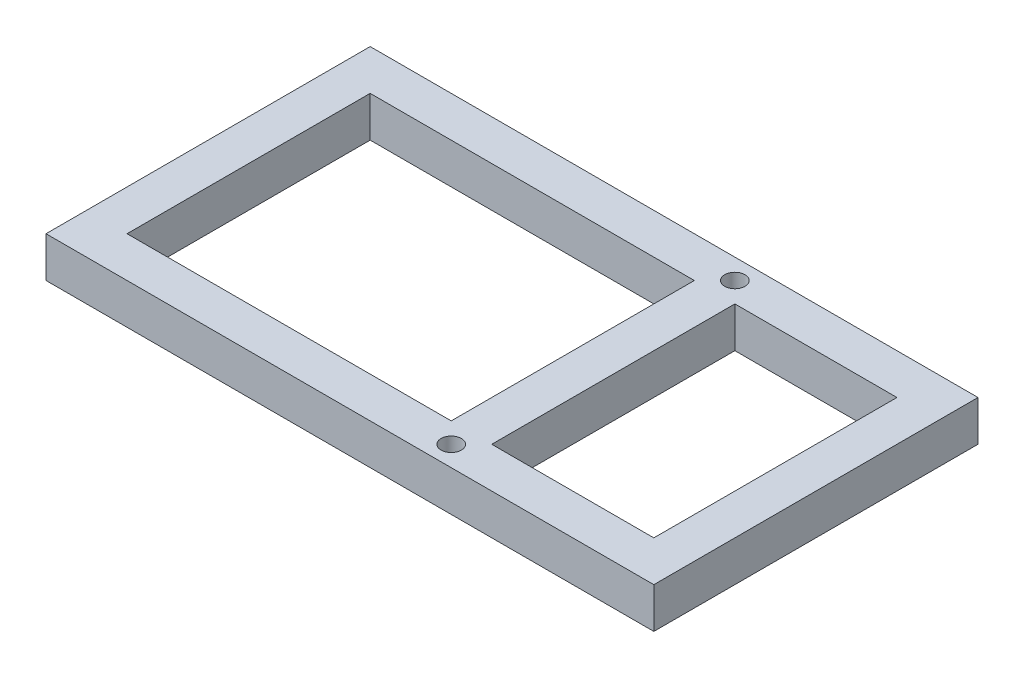
ISO-10303-21;
HEADER;
FILE_DESCRIPTION(('STEP AP214'),'2;1');
FILE_NAME('part.step','',(''),(''),'','','');
FILE_SCHEMA(('AUTOMOTIVE_DESIGN { 1 0 10303 214 1 1 1 1 }'));
ENDSEC;
DATA;
#1=APPLICATION_CONTEXT('core data for automotive mechanical design processes');
#2=APPLICATION_PROTOCOL_DEFINITION('international standard','automotive_design',2000,#1);
#3=PRODUCT_CONTEXT('',#1,'mechanical');
#4=PRODUCT('Part','Part','',(#3));
#5=PRODUCT_RELATED_PRODUCT_CATEGORY('part','',(#4));
#6=PRODUCT_DEFINITION_FORMATION('','',#4);
#7=PRODUCT_DEFINITION_CONTEXT('part definition',#1,'design');
#8=PRODUCT_DEFINITION('design','',#6,#7);
#9=PRODUCT_DEFINITION_SHAPE('','',#8);
#10=(LENGTH_UNIT() NAMED_UNIT(*) SI_UNIT(.MILLI.,.METRE.));
#11=(NAMED_UNIT(*) PLANE_ANGLE_UNIT() SI_UNIT($,.RADIAN.));
#12=(NAMED_UNIT(*) SI_UNIT($,.STERADIAN.) SOLID_ANGLE_UNIT());
#13=UNCERTAINTY_MEASURE_WITH_UNIT(LENGTH_MEASURE(1.E-05),#10,'distance_accuracy_value','');
#14=(GEOMETRIC_REPRESENTATION_CONTEXT(3) GLOBAL_UNCERTAINTY_ASSIGNED_CONTEXT((#13)) GLOBAL_UNIT_ASSIGNED_CONTEXT((#10,
#11,#12)) REPRESENTATION_CONTEXT('',''));
#15=CARTESIAN_POINT('',(0.,0.,0.));
#16=DIRECTION('',(0.,0.,1.));
#17=DIRECTION('',(1.,0.,0.));
#18=AXIS2_PLACEMENT_3D('',#15,#16,#17);
#19=CARTESIAN_POINT('',(75.,-10.,-40.));
#20=DIRECTION('',(1.,0.,0.));
#21=DIRECTION('',(0.,0.,-1.));
#22=AXIS2_PLACEMENT_3D('',#19,#20,#21);
#23=PLANE('',#22);
#24=DIRECTION('',(0.,0.,-1.));
#25=VECTOR('',#24,1.);
#26=CARTESIAN_POINT('',(75.,0.,-40.));
#27=LINE('',#26,#25);
#28=CARTESIAN_POINT('',(75.,0.,40.));
#29=VERTEX_POINT('',#28);
#30=CARTESIAN_POINT('',(75.,0.,-40.));
#31=VERTEX_POINT('',#30);
#32=EDGE_CURVE('E168',#29,#31,#27,.T.);
#33=ORIENTED_EDGE('',*,*,#32,.F.);
#34=DIRECTION('',(0.,1.,0.));
#35=VECTOR('',#34,1.);
#36=CARTESIAN_POINT('',(75.,-10.,40.));
#37=LINE('',#36,#35);
#38=CARTESIAN_POINT('',(75.,-10.,40.));
#39=VERTEX_POINT('',#38);
#40=EDGE_CURVE('E11',#39,#29,#37,.T.);
#41=ORIENTED_EDGE('',*,*,#40,.F.);
#42=DIRECTION('',(0.,0.,-1.));
#43=VECTOR('',#42,1.);
#44=CARTESIAN_POINT('',(75.,-10.,-40.));
#45=LINE('',#44,#43);
#46=CARTESIAN_POINT('',(75.,-10.,-40.));
#47=VERTEX_POINT('',#46);
#48=EDGE_CURVE('E202',#39,#47,#45,.T.);
#49=ORIENTED_EDGE('',*,*,#48,.T.);
#50=DIRECTION('',(0.,1.,0.));
#51=VECTOR('',#50,1.);
#52=CARTESIAN_POINT('',(75.,-10.,-40.));
#53=LINE('',#52,#51);
#54=EDGE_CURVE('E41',#47,#31,#53,.T.);
#55=ORIENTED_EDGE('',*,*,#54,.T.);
#56=EDGE_LOOP('',(#33,#41,#49,#55));
#57=FACE_BOUND('',#56,.T.);
#58=ADVANCED_FACE('F38',(#57),#23,.T.);
#59=CARTESIAN_POINT('',(-75.,-10.,40.));
#60=DIRECTION('',(0.,0.,1.));
#61=DIRECTION('',(1.,0.,0.));
#62=AXIS2_PLACEMENT_3D('',#59,#60,#61);
#63=PLANE('',#62);
#64=DIRECTION('',(1.,0.,0.));
#65=VECTOR('',#64,1.);
#66=CARTESIAN_POINT('',(-75.,0.,40.));
#67=LINE('',#66,#65);
#68=CARTESIAN_POINT('',(-75.,0.,40.));
#69=VERTEX_POINT('',#68);
#70=EDGE_CURVE('E206',#69,#29,#67,.T.);
#71=ORIENTED_EDGE('',*,*,#70,.F.);
#72=DIRECTION('',(0.,1.,0.));
#73=VECTOR('',#72,1.);
#74=CARTESIAN_POINT('',(-75.,-10.,40.));
#75=LINE('',#74,#73);
#76=CARTESIAN_POINT('',(-75.,-10.,40.));
#77=VERTEX_POINT('',#76);
#78=EDGE_CURVE('E46',#77,#69,#75,.T.);
#79=ORIENTED_EDGE('',*,*,#78,.F.);
#80=DIRECTION('',(1.,0.,0.));
#81=VECTOR('',#80,1.);
#82=CARTESIAN_POINT('',(-75.,-10.,40.));
#83=LINE('',#82,#81);
#84=EDGE_CURVE('E212',#77,#39,#83,.T.);
#85=ORIENTED_EDGE('',*,*,#84,.T.);
#86=ORIENTED_EDGE('',*,*,#40,.T.);
#87=EDGE_LOOP('',(#71,#79,#85,#86));
#88=FACE_BOUND('',#87,.T.);
#89=ADVANCED_FACE('F238',(#88),#63,.T.);
#90=CARTESIAN_POINT('',(-75.,-10.,-40.));
#91=DIRECTION('',(-1.,0.,0.));
#92=DIRECTION('',(0.,0.,1.));
#93=AXIS2_PLACEMENT_3D('',#90,#91,#92);
#94=PLANE('',#93);
#95=DIRECTION('',(0.,0.,1.));
#96=VECTOR('',#95,1.);
#97=CARTESIAN_POINT('',(-75.,0.,-40.));
#98=LINE('',#97,#96);
#99=CARTESIAN_POINT('',(-75.,0.,-40.));
#100=VERTEX_POINT('',#99);
#101=EDGE_CURVE('E220',#100,#69,#98,.T.);
#102=ORIENTED_EDGE('',*,*,#101,.F.);
#103=DIRECTION('',(0.,1.,0.));
#104=VECTOR('',#103,1.);
#105=CARTESIAN_POINT('',(-75.,-10.,-40.));
#106=LINE('',#105,#104);
#107=CARTESIAN_POINT('',(-75.,-10.,-40.));
#108=VERTEX_POINT('',#107);
#109=EDGE_CURVE('E225',#108,#100,#106,.T.);
#110=ORIENTED_EDGE('',*,*,#109,.F.);
#111=DIRECTION('',(0.,0.,1.));
#112=VECTOR('',#111,1.);
#113=CARTESIAN_POINT('',(-75.,-10.,-40.));
#114=LINE('',#113,#112);
#115=EDGE_CURVE('E209',#108,#77,#114,.T.);
#116=ORIENTED_EDGE('',*,*,#115,.T.);
#117=ORIENTED_EDGE('',*,*,#78,.T.);
#118=EDGE_LOOP('',(#102,#110,#116,#117));
#119=FACE_BOUND('',#118,.T.);
#120=ADVANCED_FACE('F243',(#119),#94,.T.);
#121=CARTESIAN_POINT('',(-75.,-10.,-40.));
#122=DIRECTION('',(0.,0.,-1.));
#123=DIRECTION('',(-1.,0.,0.));
#124=AXIS2_PLACEMENT_3D('',#121,#122,#123);
#125=PLANE('',#124);
#126=DIRECTION('',(-1.,0.,0.));
#127=VECTOR('',#126,1.);
#128=CARTESIAN_POINT('',(-75.,0.,-40.));
#129=LINE('',#128,#127);
#130=EDGE_CURVE('E217',#31,#100,#129,.T.);
#131=ORIENTED_EDGE('',*,*,#130,.F.);
#132=ORIENTED_EDGE('',*,*,#54,.F.);
#133=DIRECTION('',(-1.,0.,0.));
#134=VECTOR('',#133,1.);
#135=CARTESIAN_POINT('',(-75.,-10.,-40.));
#136=LINE('',#135,#134);
#137=EDGE_CURVE('E205',#47,#108,#136,.T.);
#138=ORIENTED_EDGE('',*,*,#137,.T.);
#139=ORIENTED_EDGE('',*,*,#109,.T.);
#140=EDGE_LOOP('',(#131,#132,#138,#139));
#141=FACE_BOUND('',#140,.T.);
#142=ADVANCED_FACE('F233',(#141),#125,.T.);
#143=CARTESIAN_POINT('',(0.,-10.,0.));
#144=DIRECTION('',(0.,1.,0.));
#145=DIRECTION('',(0.,0.,1.));
#146=AXIS2_PLACEMENT_3D('',#143,#144,#145);
#147=PLANE('',#146);
#148=CARTESIAN_POINT('',(20.,-10.,-35.));
#149=DIRECTION('',(0.,1.,0.));
#150=DIRECTION('',(0.,0.,1.));
#151=AXIS2_PLACEMENT_3D('',#148,#149,#150);
#152=CIRCLE('',#151,2.5);
#153=CARTESIAN_POINT('',(20.,-10.,-32.5));
#154=VERTEX_POINT('',#153);
#155=EDGE_CURVE('E187',#154,#154,#152,.T.);
#156=ORIENTED_EDGE('',*,*,#155,.T.);
#157=EDGE_LOOP('',(#156));
#158=FACE_BOUND('',#157,.T.);
#159=CARTESIAN_POINT('',(19.9999999999999,-10.,35.));
#160=DIRECTION('',(0.,1.,0.));
#161=DIRECTION('',(0.,0.,-1.));
#162=AXIS2_PLACEMENT_3D('',#159,#160,#161);
#163=CIRCLE('',#162,2.5);
#164=CARTESIAN_POINT('',(19.9999999999999,-10.,32.5));
#165=VERTEX_POINT('',#164);
#166=EDGE_CURVE('E390',#165,#165,#163,.T.);
#167=ORIENTED_EDGE('',*,*,#166,.T.);
#168=EDGE_LOOP('',(#167));
#169=FACE_BOUND('',#168,.T.);
#170=DIRECTION('',(1.,0.,0.));
#171=VECTOR('',#170,1.);
#172=CARTESIAN_POINT('',(-65.,-10.,30.));
#173=LINE('',#172,#171);
#174=CARTESIAN_POINT('',(-65.,-10.,30.));
#175=VERTEX_POINT('',#174);
#176=CARTESIAN_POINT('',(15.,-10.,30.));
#177=VERTEX_POINT('',#176);
#178=EDGE_CURVE('E139',#175,#177,#173,.T.);
#179=ORIENTED_EDGE('',*,*,#178,.T.);
#180=DIRECTION('',(0.,0.,-1.));
#181=VECTOR('',#180,1.);
#182=CARTESIAN_POINT('',(15.,-10.,-30.));
#183=LINE('',#182,#181);
#184=CARTESIAN_POINT('',(15.,-10.,-30.));
#185=VERTEX_POINT('',#184);
#186=EDGE_CURVE('E131',#177,#185,#183,.T.);
#187=ORIENTED_EDGE('',*,*,#186,.T.);
#188=DIRECTION('',(-1.,0.,0.));
#189=VECTOR('',#188,1.);
#190=CARTESIAN_POINT('',(-65.,-10.,-30.));
#191=LINE('',#190,#189);
#192=CARTESIAN_POINT('',(-65.,-10.,-30.));
#193=VERTEX_POINT('',#192);
#194=EDGE_CURVE('E142',#185,#193,#191,.T.);
#195=ORIENTED_EDGE('',*,*,#194,.T.);
#196=DIRECTION('',(0.,0.,1.));
#197=VECTOR('',#196,1.);
#198=CARTESIAN_POINT('',(-65.,-10.,-30.));
#199=LINE('',#198,#197);
#200=EDGE_CURVE('E54',#193,#175,#199,.T.);
#201=ORIENTED_EDGE('',*,*,#200,.T.);
#202=EDGE_LOOP('',(#179,#187,#195,#201));
#203=FACE_BOUND('',#202,.T.);
#204=DIRECTION('',(-1.,0.,0.));
#205=VECTOR('',#204,1.);
#206=CARTESIAN_POINT('',(65.,-10.,-30.));
#207=LINE('',#206,#205);
#208=CARTESIAN_POINT('',(65.,-10.,-30.));
#209=VERTEX_POINT('',#208);
#210=CARTESIAN_POINT('',(25.,-10.,-30.));
#211=VERTEX_POINT('',#210);
#212=EDGE_CURVE('E180',#209,#211,#207,.T.);
#213=ORIENTED_EDGE('',*,*,#212,.T.);
#214=DIRECTION('',(0.,0.,1.));
#215=VECTOR('',#214,1.);
#216=CARTESIAN_POINT('',(25.,-10.,-30.));
#217=LINE('',#216,#215);
#218=CARTESIAN_POINT('',(25.,-10.,30.));
#219=VERTEX_POINT('',#218);
#220=EDGE_CURVE('E172',#211,#219,#217,.T.);
#221=ORIENTED_EDGE('',*,*,#220,.T.);
#222=DIRECTION('',(1.,0.,0.));
#223=VECTOR('',#222,1.);
#224=CARTESIAN_POINT('',(65.,-10.,30.));
#225=LINE('',#224,#223);
#226=CARTESIAN_POINT('',(65.,-10.,30.));
#227=VERTEX_POINT('',#226);
#228=EDGE_CURVE('E175',#219,#227,#225,.T.);
#229=ORIENTED_EDGE('',*,*,#228,.T.);
#230=DIRECTION('',(0.,0.,-1.));
#231=VECTOR('',#230,1.);
#232=CARTESIAN_POINT('',(65.,-10.,-30.));
#233=LINE('',#232,#231);
#234=EDGE_CURVE('E62',#227,#209,#233,.T.);
#235=ORIENTED_EDGE('',*,*,#234,.T.);
#236=EDGE_LOOP('',(#213,#221,#229,#235));
#237=FACE_BOUND('',#236,.T.);
#238=ORIENTED_EDGE('',*,*,#48,.F.);
#239=ORIENTED_EDGE('',*,*,#84,.F.);
#240=ORIENTED_EDGE('',*,*,#115,.F.);
#241=ORIENTED_EDGE('',*,*,#137,.F.);
#242=EDGE_LOOP('',(#238,#239,#240,#241));
#243=FACE_BOUND('',#242,.T.);
#244=ADVANCED_FACE('F146',(#158,#169,#203,#237,#243),#147,.F.);
#245=CARTESIAN_POINT('',(0.,0.,0.));
#246=DIRECTION('',(0.,1.,0.));
#247=DIRECTION('',(0.,0.,1.));
#248=AXIS2_PLACEMENT_3D('',#245,#246,#247);
#249=PLANE('',#248);
#250=CARTESIAN_POINT('',(20.,0.,-35.));
#251=DIRECTION('',(0.,1.,0.));
#252=DIRECTION('',(0.,0.,1.));
#253=AXIS2_PLACEMENT_3D('',#250,#251,#252);
#254=CIRCLE('',#253,2.5);
#255=CARTESIAN_POINT('',(20.,0.,-32.5));
#256=VERTEX_POINT('',#255);
#257=EDGE_CURVE('E389',#256,#256,#254,.T.);
#258=ORIENTED_EDGE('',*,*,#257,.F.);
#259=EDGE_LOOP('',(#258));
#260=FACE_BOUND('',#259,.T.);
#261=CARTESIAN_POINT('',(19.9999999999999,0.,35.));
#262=DIRECTION('',(0.,1.,0.));
#263=DIRECTION('',(0.,0.,-1.));
#264=AXIS2_PLACEMENT_3D('',#261,#262,#263);
#265=CIRCLE('',#264,2.5);
#266=CARTESIAN_POINT('',(19.9999999999999,0.,32.5));
#267=VERTEX_POINT('',#266);
#268=EDGE_CURVE('E155',#267,#267,#265,.T.);
#269=ORIENTED_EDGE('',*,*,#268,.F.);
#270=EDGE_LOOP('',(#269));
#271=FACE_BOUND('',#270,.T.);
#272=DIRECTION('',(0.,0.,-1.));
#273=VECTOR('',#272,1.);
#274=CARTESIAN_POINT('',(15.,0.,-30.));
#275=LINE('',#274,#273);
#276=CARTESIAN_POINT('',(15.,0.,30.));
#277=VERTEX_POINT('',#276);
#278=CARTESIAN_POINT('',(15.,0.,-30.));
#279=VERTEX_POINT('',#278);
#280=EDGE_CURVE('E134',#277,#279,#275,.T.);
#281=ORIENTED_EDGE('',*,*,#280,.F.);
#282=DIRECTION('',(1.,0.,0.));
#283=VECTOR('',#282,1.);
#284=CARTESIAN_POINT('',(-65.,0.,30.));
#285=LINE('',#284,#283);
#286=CARTESIAN_POINT('',(-65.,0.,30.));
#287=VERTEX_POINT('',#286);
#288=EDGE_CURVE('E149',#287,#277,#285,.T.);
#289=ORIENTED_EDGE('',*,*,#288,.F.);
#290=DIRECTION('',(0.,0.,1.));
#291=VECTOR('',#290,1.);
#292=CARTESIAN_POINT('',(-65.,0.,-30.));
#293=LINE('',#292,#291);
#294=CARTESIAN_POINT('',(-65.,0.,-30.));
#295=VERTEX_POINT('',#294);
#296=EDGE_CURVE('E152',#295,#287,#293,.T.);
#297=ORIENTED_EDGE('',*,*,#296,.F.);
#298=DIRECTION('',(-1.,0.,0.));
#299=VECTOR('',#298,1.);
#300=CARTESIAN_POINT('',(-65.,0.,-30.));
#301=LINE('',#300,#299);
#302=EDGE_CURVE('E161',#279,#295,#301,.T.);
#303=ORIENTED_EDGE('',*,*,#302,.F.);
#304=EDGE_LOOP('',(#281,#289,#297,#303));
#305=FACE_BOUND('',#304,.T.);
#306=DIRECTION('',(0.,0.,1.));
#307=VECTOR('',#306,1.);
#308=CARTESIAN_POINT('',(25.,0.,-30.));
#309=LINE('',#308,#307);
#310=CARTESIAN_POINT('',(25.,0.,-30.));
#311=VERTEX_POINT('',#310);
#312=CARTESIAN_POINT('',(25.,0.,30.));
#313=VERTEX_POINT('',#312);
#314=EDGE_CURVE('E184',#311,#313,#309,.T.);
#315=ORIENTED_EDGE('',*,*,#314,.F.);
#316=DIRECTION('',(-1.,0.,0.));
#317=VECTOR('',#316,1.);
#318=CARTESIAN_POINT('',(65.,0.,-30.));
#319=LINE('',#318,#317);
#320=CARTESIAN_POINT('',(65.,0.,-30.));
#321=VERTEX_POINT('',#320);
#322=EDGE_CURVE('E176',#321,#311,#319,.T.);
#323=ORIENTED_EDGE('',*,*,#322,.F.);
#324=DIRECTION('',(0.,0.,-1.));
#325=VECTOR('',#324,1.);
#326=CARTESIAN_POINT('',(65.,0.,-30.));
#327=LINE('',#326,#325);
#328=CARTESIAN_POINT('',(65.,0.,30.));
#329=VERTEX_POINT('',#328);
#330=EDGE_CURVE('E190',#329,#321,#327,.T.);
#331=ORIENTED_EDGE('',*,*,#330,.F.);
#332=DIRECTION('',(1.,0.,0.));
#333=VECTOR('',#332,1.);
#334=CARTESIAN_POINT('',(65.,0.,30.));
#335=LINE('',#334,#333);
#336=EDGE_CURVE('E186',#313,#329,#335,.T.);
#337=ORIENTED_EDGE('',*,*,#336,.F.);
#338=EDGE_LOOP('',(#315,#323,#331,#337));
#339=FACE_BOUND('',#338,.T.);
#340=ORIENTED_EDGE('',*,*,#32,.T.);
#341=ORIENTED_EDGE('',*,*,#130,.T.);
#342=ORIENTED_EDGE('',*,*,#101,.T.);
#343=ORIENTED_EDGE('',*,*,#70,.T.);
#344=EDGE_LOOP('',(#340,#341,#342,#343));
#345=FACE_BOUND('',#344,.T.);
#346=ADVANCED_FACE('F235',(#260,#271,#305,#339,#345),#249,.T.);
#347=CARTESIAN_POINT('',(25.,-10.,-30.));
#348=DIRECTION('',(-1.,0.,0.));
#349=DIRECTION('',(0.,0.,1.));
#350=AXIS2_PLACEMENT_3D('',#347,#348,#349);
#351=PLANE('',#350);
#352=ORIENTED_EDGE('',*,*,#314,.T.);
#353=DIRECTION('',(0.,1.,0.));
#354=VECTOR('',#353,1.);
#355=CARTESIAN_POINT('',(25.,-10.,30.));
#356=LINE('',#355,#354);
#357=EDGE_CURVE('E183',#219,#313,#356,.T.);
#358=ORIENTED_EDGE('',*,*,#357,.F.);
#359=ORIENTED_EDGE('',*,*,#220,.F.);
#360=DIRECTION('',(0.,1.,0.));
#361=VECTOR('',#360,1.);
#362=CARTESIAN_POINT('',(25.,-10.,-30.));
#363=LINE('',#362,#361);
#364=EDGE_CURVE('E162',#211,#311,#363,.T.);
#365=ORIENTED_EDGE('',*,*,#364,.T.);
#366=EDGE_LOOP('',(#352,#358,#359,#365));
#367=FACE_BOUND('',#366,.T.);
#368=ADVANCED_FACE('F275',(#367),#351,.F.);
#369=CARTESIAN_POINT('',(65.,-10.,-30.));
#370=DIRECTION('',(0.,0.,-1.));
#371=DIRECTION('',(-1.,0.,0.));
#372=AXIS2_PLACEMENT_3D('',#369,#370,#371);
#373=PLANE('',#372);
#374=ORIENTED_EDGE('',*,*,#322,.T.);
#375=ORIENTED_EDGE('',*,*,#364,.F.);
#376=ORIENTED_EDGE('',*,*,#212,.F.);
#377=DIRECTION('',(0.,1.,0.));
#378=VECTOR('',#377,1.);
#379=CARTESIAN_POINT('',(65.,-10.,-30.));
#380=LINE('',#379,#378);
#381=EDGE_CURVE('E196',#209,#321,#380,.T.);
#382=ORIENTED_EDGE('',*,*,#381,.T.);
#383=EDGE_LOOP('',(#374,#375,#376,#382));
#384=FACE_BOUND('',#383,.T.);
#385=ADVANCED_FACE('F280',(#384),#373,.F.);
#386=CARTESIAN_POINT('',(65.,-10.,-30.));
#387=DIRECTION('',(1.,0.,0.));
#388=DIRECTION('',(0.,0.,-1.));
#389=AXIS2_PLACEMENT_3D('',#386,#387,#388);
#390=PLANE('',#389);
#391=ORIENTED_EDGE('',*,*,#330,.T.);
#392=ORIENTED_EDGE('',*,*,#381,.F.);
#393=ORIENTED_EDGE('',*,*,#234,.F.);
#394=DIRECTION('',(0.,1.,0.));
#395=VECTOR('',#394,1.);
#396=CARTESIAN_POINT('',(65.,-10.,30.));
#397=LINE('',#396,#395);
#398=EDGE_CURVE('E198',#227,#329,#397,.T.);
#399=ORIENTED_EDGE('',*,*,#398,.T.);
#400=EDGE_LOOP('',(#391,#392,#393,#399));
#401=FACE_BOUND('',#400,.T.);
#402=ADVANCED_FACE('F292',(#401),#390,.F.);
#403=CARTESIAN_POINT('',(65.,-10.,30.));
#404=DIRECTION('',(0.,0.,1.));
#405=DIRECTION('',(1.,0.,0.));
#406=AXIS2_PLACEMENT_3D('',#403,#404,#405);
#407=PLANE('',#406);
#408=ORIENTED_EDGE('',*,*,#336,.T.);
#409=ORIENTED_EDGE('',*,*,#398,.F.);
#410=ORIENTED_EDGE('',*,*,#228,.F.);
#411=ORIENTED_EDGE('',*,*,#357,.T.);
#412=EDGE_LOOP('',(#408,#409,#410,#411));
#413=FACE_BOUND('',#412,.T.);
#414=ADVANCED_FACE('F302',(#413),#407,.F.);
#415=CARTESIAN_POINT('',(15.,-10.,-30.));
#416=DIRECTION('',(1.,0.,0.));
#417=DIRECTION('',(0.,0.,-1.));
#418=AXIS2_PLACEMENT_3D('',#415,#416,#417);
#419=PLANE('',#418);
#420=ORIENTED_EDGE('',*,*,#280,.T.);
#421=DIRECTION('',(0.,1.,0.));
#422=VECTOR('',#421,1.);
#423=CARTESIAN_POINT('',(15.,-10.,-30.));
#424=LINE('',#423,#422);
#425=EDGE_CURVE('E127',#185,#279,#424,.T.);
#426=ORIENTED_EDGE('',*,*,#425,.F.);
#427=ORIENTED_EDGE('',*,*,#186,.F.);
#428=DIRECTION('',(0.,1.,0.));
#429=VECTOR('',#428,1.);
#430=CARTESIAN_POINT('',(15.,-10.,30.));
#431=LINE('',#430,#429);
#432=EDGE_CURVE('E166',#177,#277,#431,.T.);
#433=ORIENTED_EDGE('',*,*,#432,.T.);
#434=EDGE_LOOP('',(#420,#426,#427,#433));
#435=FACE_BOUND('',#434,.T.);
#436=ADVANCED_FACE('F129',(#435),#419,.F.);
#437=CARTESIAN_POINT('',(-65.,-10.,30.));
#438=DIRECTION('',(0.,0.,1.));
#439=DIRECTION('',(1.,0.,0.));
#440=AXIS2_PLACEMENT_3D('',#437,#438,#439);
#441=PLANE('',#440);
#442=ORIENTED_EDGE('',*,*,#288,.T.);
#443=ORIENTED_EDGE('',*,*,#432,.F.);
#444=ORIENTED_EDGE('',*,*,#178,.F.);
#445=DIRECTION('',(0.,1.,0.));
#446=VECTOR('',#445,1.);
#447=CARTESIAN_POINT('',(-65.,-10.,30.));
#448=LINE('',#447,#446);
#449=EDGE_CURVE('E169',#175,#287,#448,.T.);
#450=ORIENTED_EDGE('',*,*,#449,.T.);
#451=EDGE_LOOP('',(#442,#443,#444,#450));
#452=FACE_BOUND('',#451,.T.);
#453=ADVANCED_FACE('F320',(#452),#441,.F.);
#454=CARTESIAN_POINT('',(-65.,-10.,-30.));
#455=DIRECTION('',(-1.,0.,0.));
#456=DIRECTION('',(0.,0.,1.));
#457=AXIS2_PLACEMENT_3D('',#454,#455,#456);
#458=PLANE('',#457);
#459=ORIENTED_EDGE('',*,*,#296,.T.);
#460=ORIENTED_EDGE('',*,*,#449,.F.);
#461=ORIENTED_EDGE('',*,*,#200,.F.);
#462=DIRECTION('',(0.,1.,0.));
#463=VECTOR('',#462,1.);
#464=CARTESIAN_POINT('',(-65.,-10.,-30.));
#465=LINE('',#464,#463);
#466=EDGE_CURVE('E138',#193,#295,#465,.T.);
#467=ORIENTED_EDGE('',*,*,#466,.T.);
#468=EDGE_LOOP('',(#459,#460,#461,#467));
#469=FACE_BOUND('',#468,.T.);
#470=ADVANCED_FACE('F329',(#469),#458,.F.);
#471=CARTESIAN_POINT('',(-65.,-10.,-30.));
#472=DIRECTION('',(0.,0.,-1.));
#473=DIRECTION('',(-1.,0.,0.));
#474=AXIS2_PLACEMENT_3D('',#471,#472,#473);
#475=PLANE('',#474);
#476=ORIENTED_EDGE('',*,*,#302,.T.);
#477=ORIENTED_EDGE('',*,*,#466,.F.);
#478=ORIENTED_EDGE('',*,*,#194,.F.);
#479=ORIENTED_EDGE('',*,*,#425,.T.);
#480=EDGE_LOOP('',(#476,#477,#478,#479));
#481=FACE_BOUND('',#480,.T.);
#482=ADVANCED_FACE('F143',(#481),#475,.F.);
#483=CARTESIAN_POINT('',(19.9999999999999,-10.,35.));
#484=DIRECTION('',(0.,1.,0.));
#485=DIRECTION('',(0.,0.,1.));
#486=AXIS2_PLACEMENT_3D('',#483,#484,#485);
#487=CYLINDRICAL_SURFACE('',#486,2.5);
#488=ORIENTED_EDGE('',*,*,#166,.F.);
#489=EDGE_LOOP('',(#488));
#490=FACE_BOUND('',#489,.T.);
#491=ORIENTED_EDGE('',*,*,#268,.T.);
#492=EDGE_LOOP('',(#491));
#493=FACE_BOUND('',#492,.T.);
#494=ADVANCED_FACE('F347',(#490,#493),#487,.F.);
#495=CARTESIAN_POINT('',(20.,-10.,-35.));
#496=DIRECTION('',(0.,1.,0.));
#497=DIRECTION('',(0.,0.,1.));
#498=AXIS2_PLACEMENT_3D('',#495,#496,#497);
#499=CYLINDRICAL_SURFACE('',#498,2.5);
#500=ORIENTED_EDGE('',*,*,#155,.F.);
#501=EDGE_LOOP('',(#500));
#502=FACE_BOUND('',#501,.T.);
#503=ORIENTED_EDGE('',*,*,#257,.T.);
#504=EDGE_LOOP('',(#503));
#505=FACE_BOUND('',#504,.T.);
#506=ADVANCED_FACE('F370',(#502,#505),#499,.F.);
#507=CLOSED_SHELL('',(#58,#89,#120,#142,#244,#346,#368,#385,#402,#414,#436,#453,#470,#482,#494,#506));
#508=MANIFOLD_SOLID_BREP('B2',#507);
#509=ADVANCED_BREP_SHAPE_REPRESENTATION('',(#18,#508),#14);
#510=SHAPE_DEFINITION_REPRESENTATION(#9,#509);
ENDSEC;
END-ISO-10303-21;
